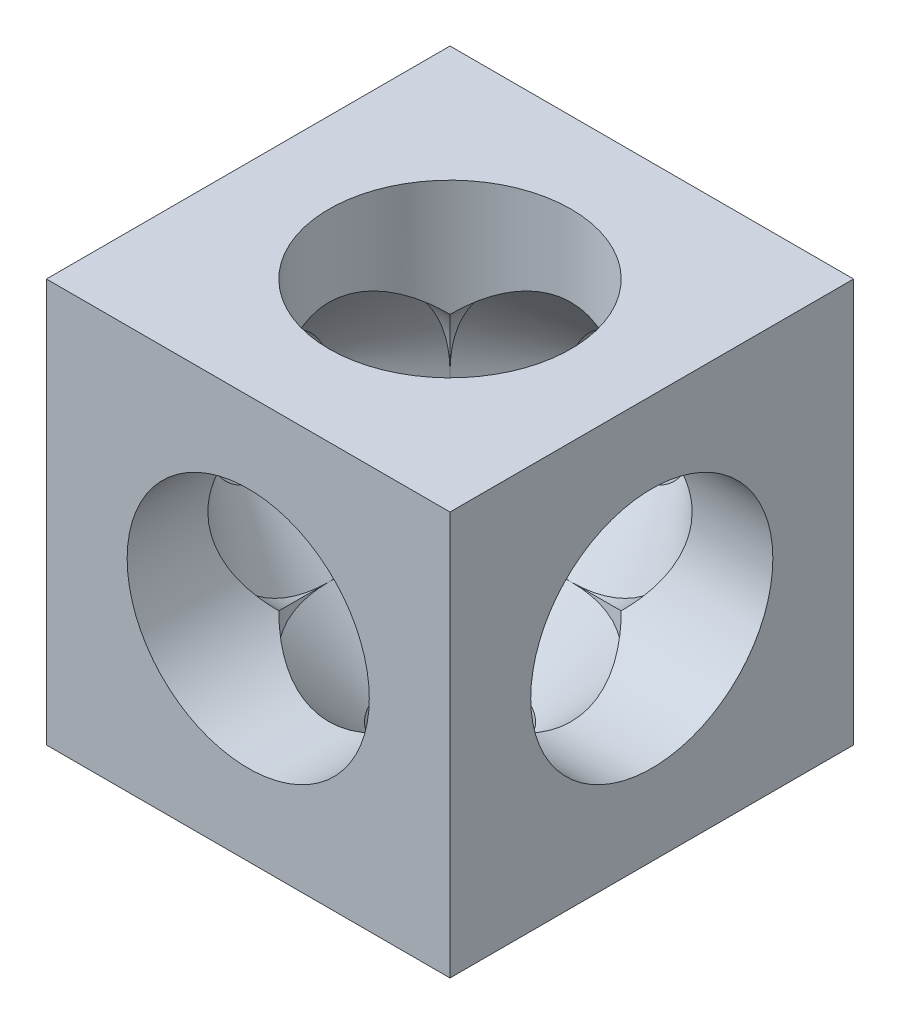
ISO-10303-21;
HEADER;
FILE_DESCRIPTION(('STEP AP214'),'2;1');
FILE_NAME('part.step','',(''),(''),'','','');
FILE_SCHEMA(('AUTOMOTIVE_DESIGN { 1 0 10303 214 1 1 1 1 }'));
ENDSEC;
DATA;
#1=APPLICATION_CONTEXT('core data for automotive mechanical design processes');
#2=APPLICATION_PROTOCOL_DEFINITION('international standard','automotive_design',2000,#1);
#3=PRODUCT_CONTEXT('',#1,'mechanical');
#4=PRODUCT('Part','Part','',(#3));
#5=PRODUCT_RELATED_PRODUCT_CATEGORY('part','',(#4));
#6=PRODUCT_DEFINITION_FORMATION('','',#4);
#7=PRODUCT_DEFINITION_CONTEXT('part definition',#1,'design');
#8=PRODUCT_DEFINITION('design','',#6,#7);
#9=PRODUCT_DEFINITION_SHAPE('','',#8);
#10=(LENGTH_UNIT() NAMED_UNIT(*) SI_UNIT(.MILLI.,.METRE.));
#11=(NAMED_UNIT(*) PLANE_ANGLE_UNIT() SI_UNIT($,.RADIAN.));
#12=(NAMED_UNIT(*) SI_UNIT($,.STERADIAN.) SOLID_ANGLE_UNIT());
#13=UNCERTAINTY_MEASURE_WITH_UNIT(LENGTH_MEASURE(1.E-05),#10,'distance_accuracy_value','');
#14=(GEOMETRIC_REPRESENTATION_CONTEXT(3) GLOBAL_UNCERTAINTY_ASSIGNED_CONTEXT((#13)) GLOBAL_UNIT_ASSIGNED_CONTEXT((#10,
#11,#12)) REPRESENTATION_CONTEXT('',''));
#15=CARTESIAN_POINT('',(0.,0.,0.));
#16=DIRECTION('',(0.,0.,1.));
#17=DIRECTION('',(1.,0.,0.));
#18=AXIS2_PLACEMENT_3D('',#15,#16,#17);
#19=CARTESIAN_POINT('',(0.,0.,5.));
#20=DIRECTION('',(0.,0.,1.));
#21=DIRECTION('',(1.,0.,0.));
#22=AXIS2_PLACEMENT_3D('',#19,#20,#21);
#23=PLANE('',#22);
#24=CARTESIAN_POINT('',(0.,0.,5.));
#25=DIRECTION('',(0.,0.,-1.));
#26=DIRECTION('',(-1.,0.,0.));
#27=AXIS2_PLACEMENT_3D('',#24,#25,#26);
#28=CIRCLE('',#27,3.);
#29=CARTESIAN_POINT('',(-3.,0.,5.));
#30=VERTEX_POINT('',#29);
#31=EDGE_CURVE('E234',#30,#30,#28,.T.);
#32=ORIENTED_EDGE('',*,*,#31,.T.);
#33=EDGE_LOOP('',(#32));
#34=FACE_BOUND('',#33,.T.);
#35=DIRECTION('',(0.,-1.,0.));
#36=VECTOR('',#35,1.);
#37=CARTESIAN_POINT('',(5.,5.,5.));
#38=LINE('',#37,#36);
#39=CARTESIAN_POINT('',(5.,5.,5.));
#40=VERTEX_POINT('',#39);
#41=CARTESIAN_POINT('',(5.,-5.,5.));
#42=VERTEX_POINT('',#41);
#43=EDGE_CURVE('E284',#40,#42,#38,.T.);
#44=ORIENTED_EDGE('',*,*,#43,.F.);
#45=DIRECTION('',(1.,0.,0.));
#46=VECTOR('',#45,1.);
#47=CARTESIAN_POINT('',(-5.,5.,5.));
#48=LINE('',#47,#46);
#49=CARTESIAN_POINT('',(-5.,5.,5.));
#50=VERTEX_POINT('',#49);
#51=EDGE_CURVE('E10',#50,#40,#48,.T.);
#52=ORIENTED_EDGE('',*,*,#51,.F.);
#53=DIRECTION('',(0.,1.,0.));
#54=VECTOR('',#53,1.);
#55=CARTESIAN_POINT('',(-5.,-5.,5.));
#56=LINE('',#55,#54);
#57=CARTESIAN_POINT('',(-5.,-5.,5.));
#58=VERTEX_POINT('',#57);
#59=EDGE_CURVE('E212',#58,#50,#56,.T.);
#60=ORIENTED_EDGE('',*,*,#59,.F.);
#61=DIRECTION('',(-1.,0.,0.));
#62=VECTOR('',#61,1.);
#63=CARTESIAN_POINT('',(5.,-5.,5.));
#64=LINE('',#63,#62);
#65=EDGE_CURVE('E254',#42,#58,#64,.T.);
#66=ORIENTED_EDGE('',*,*,#65,.F.);
#67=EDGE_LOOP('',(#44,#52,#60,#66));
#68=FACE_BOUND('',#67,.T.);
#69=ADVANCED_FACE('F16',(#34,#68),#23,.T.);
#70=CARTESIAN_POINT('',(-5.,5.,0.));
#71=DIRECTION('',(0.,1.,0.));
#72=DIRECTION('',(1.,0.,0.));
#73=AXIS2_PLACEMENT_3D('',#70,#71,#72);
#74=PLANE('',#73);
#75=CARTESIAN_POINT('',(0.,5.,0.));
#76=DIRECTION('',(0.,-1.,0.));
#77=DIRECTION('',(0.,0.,-1.));
#78=AXIS2_PLACEMENT_3D('',#75,#76,#77);
#79=CIRCLE('',#78,3.);
#80=CARTESIAN_POINT('',(0.,5.,-3.));
#81=VERTEX_POINT('',#80);
#82=EDGE_CURVE('E219',#81,#81,#79,.T.);
#83=ORIENTED_EDGE('',*,*,#82,.T.);
#84=EDGE_LOOP('',(#83));
#85=FACE_BOUND('',#84,.T.);
#86=ORIENTED_EDGE('',*,*,#51,.T.);
#87=DIRECTION('',(0.,0.,-1.));
#88=VECTOR('',#87,1.);
#89=CARTESIAN_POINT('',(5.,5.,5.));
#90=LINE('',#89,#88);
#91=CARTESIAN_POINT('',(5.,5.,-5.));
#92=VERTEX_POINT('',#91);
#93=EDGE_CURVE('E250',#40,#92,#90,.T.);
#94=ORIENTED_EDGE('',*,*,#93,.T.);
#95=DIRECTION('',(-1.,0.,0.));
#96=VECTOR('',#95,1.);
#97=CARTESIAN_POINT('',(5.,5.,-5.));
#98=LINE('',#97,#96);
#99=CARTESIAN_POINT('',(-5.,5.,-5.));
#100=VERTEX_POINT('',#99);
#101=EDGE_CURVE('E301',#92,#100,#98,.T.);
#102=ORIENTED_EDGE('',*,*,#101,.T.);
#103=DIRECTION('',(0.,0.,1.));
#104=VECTOR('',#103,1.);
#105=CARTESIAN_POINT('',(-5.,5.,-5.));
#106=LINE('',#105,#104);
#107=EDGE_CURVE('E27',#100,#50,#106,.T.);
#108=ORIENTED_EDGE('',*,*,#107,.T.);
#109=EDGE_LOOP('',(#86,#94,#102,#108));
#110=FACE_BOUND('',#109,.T.);
#111=ADVANCED_FACE('F603',(#85,#110),#74,.T.);
#112=CARTESIAN_POINT('',(-5.,-5.,0.));
#113=DIRECTION('',(-1.,0.,0.));
#114=DIRECTION('',(0.,0.,1.));
#115=AXIS2_PLACEMENT_3D('',#112,#113,#114);
#116=PLANE('',#115);
#117=CARTESIAN_POINT('',(-5.,0.,0.));
#118=DIRECTION('',(1.,0.,0.));
#119=DIRECTION('',(0.,0.,-1.));
#120=AXIS2_PLACEMENT_3D('',#117,#118,#119);
#121=CIRCLE('',#120,1.5);
#122=CARTESIAN_POINT('',(-5.,0.,-1.5));
#123=VERTEX_POINT('',#122);
#124=EDGE_CURVE('E214',#123,#123,#121,.T.);
#125=ORIENTED_EDGE('',*,*,#124,.T.);
#126=EDGE_LOOP('',(#125));
#127=FACE_BOUND('',#126,.T.);
#128=ORIENTED_EDGE('',*,*,#59,.T.);
#129=ORIENTED_EDGE('',*,*,#107,.F.);
#130=DIRECTION('',(0.,-1.,0.));
#131=VECTOR('',#130,1.);
#132=CARTESIAN_POINT('',(-5.,5.,-5.));
#133=LINE('',#132,#131);
#134=CARTESIAN_POINT('',(-5.,-5.,-5.));
#135=VERTEX_POINT('',#134);
#136=EDGE_CURVE('E297',#100,#135,#133,.T.);
#137=ORIENTED_EDGE('',*,*,#136,.T.);
#138=DIRECTION('',(0.,0.,-1.));
#139=VECTOR('',#138,1.);
#140=CARTESIAN_POINT('',(-5.,-5.,5.));
#141=LINE('',#140,#139);
#142=EDGE_CURVE('E348',#58,#135,#141,.T.);
#143=ORIENTED_EDGE('',*,*,#142,.F.);
#144=EDGE_LOOP('',(#128,#129,#137,#143));
#145=FACE_BOUND('',#144,.T.);
#146=ADVANCED_FACE('F366',(#127,#145),#116,.T.);
#147=CARTESIAN_POINT('',(5.,-5.,0.));
#148=DIRECTION('',(0.,-1.,0.));
#149=DIRECTION('',(0.,0.,-1.));
#150=AXIS2_PLACEMENT_3D('',#147,#148,#149);
#151=PLANE('',#150);
#152=CARTESIAN_POINT('',(0.,-5.,0.));
#153=DIRECTION('',(0.,1.,0.));
#154=DIRECTION('',(0.,0.,-1.));
#155=AXIS2_PLACEMENT_3D('',#152,#153,#154);
#156=CIRCLE('',#155,1.5);
#157=CARTESIAN_POINT('',(0.,-5.,-1.5));
#158=VERTEX_POINT('',#157);
#159=EDGE_CURVE('E109',#158,#158,#156,.T.);
#160=ORIENTED_EDGE('',*,*,#159,.T.);
#161=EDGE_LOOP('',(#160));
#162=FACE_BOUND('',#161,.T.);
#163=ORIENTED_EDGE('',*,*,#65,.T.);
#164=ORIENTED_EDGE('',*,*,#142,.T.);
#165=DIRECTION('',(1.,0.,0.));
#166=VECTOR('',#165,1.);
#167=CARTESIAN_POINT('',(-5.,-5.,-5.));
#168=LINE('',#167,#166);
#169=CARTESIAN_POINT('',(5.,-5.,-5.));
#170=VERTEX_POINT('',#169);
#171=EDGE_CURVE('E281',#135,#170,#168,.T.);
#172=ORIENTED_EDGE('',*,*,#171,.T.);
#173=DIRECTION('',(0.,0.,-1.));
#174=VECTOR('',#173,1.);
#175=CARTESIAN_POINT('',(5.,-5.,5.));
#176=LINE('',#175,#174);
#177=EDGE_CURVE('E255',#42,#170,#176,.T.);
#178=ORIENTED_EDGE('',*,*,#177,.F.);
#179=EDGE_LOOP('',(#163,#164,#172,#178));
#180=FACE_BOUND('',#179,.T.);
#181=ADVANCED_FACE('F372',(#162,#180),#151,.T.);
#182=CARTESIAN_POINT('',(5.,5.,0.));
#183=DIRECTION('',(1.,0.,0.));
#184=DIRECTION('',(0.,1.,0.));
#185=AXIS2_PLACEMENT_3D('',#182,#183,#184);
#186=PLANE('',#185);
#187=CARTESIAN_POINT('',(5.,0.,0.));
#188=DIRECTION('',(-1.,0.,0.));
#189=DIRECTION('',(0.,0.,-1.));
#190=AXIS2_PLACEMENT_3D('',#187,#188,#189);
#191=CIRCLE('',#190,3.);
#192=CARTESIAN_POINT('',(5.,0.,-3.));
#193=VERTEX_POINT('',#192);
#194=EDGE_CURVE('E310',#193,#193,#191,.T.);
#195=ORIENTED_EDGE('',*,*,#194,.T.);
#196=EDGE_LOOP('',(#195));
#197=FACE_BOUND('',#196,.T.);
#198=ORIENTED_EDGE('',*,*,#43,.T.);
#199=ORIENTED_EDGE('',*,*,#177,.T.);
#200=DIRECTION('',(0.,1.,0.));
#201=VECTOR('',#200,1.);
#202=CARTESIAN_POINT('',(5.,-5.,-5.));
#203=LINE('',#202,#201);
#204=EDGE_CURVE('E285',#170,#92,#203,.T.);
#205=ORIENTED_EDGE('',*,*,#204,.T.);
#206=ORIENTED_EDGE('',*,*,#93,.F.);
#207=EDGE_LOOP('',(#198,#199,#205,#206));
#208=FACE_BOUND('',#207,.T.);
#209=ADVANCED_FACE('F378',(#197,#208),#186,.T.);
#210=CARTESIAN_POINT('',(0.,0.,-5.));
#211=DIRECTION('',(0.,0.,1.));
#212=DIRECTION('',(1.,0.,0.));
#213=AXIS2_PLACEMENT_3D('',#210,#211,#212);
#214=PLANE('',#213);
#215=CARTESIAN_POINT('',(0.,0.,-5.));
#216=DIRECTION('',(0.,0.,1.));
#217=DIRECTION('',(-1.,0.,0.));
#218=AXIS2_PLACEMENT_3D('',#215,#216,#217);
#219=CIRCLE('',#218,1.5);
#220=CARTESIAN_POINT('',(-1.5,0.,-5.));
#221=VERTEX_POINT('',#220);
#222=EDGE_CURVE('E256',#221,#221,#219,.T.);
#223=ORIENTED_EDGE('',*,*,#222,.T.);
#224=EDGE_LOOP('',(#223));
#225=FACE_BOUND('',#224,.T.);
#226=ORIENTED_EDGE('',*,*,#136,.F.);
#227=ORIENTED_EDGE('',*,*,#101,.F.);
#228=ORIENTED_EDGE('',*,*,#204,.F.);
#229=ORIENTED_EDGE('',*,*,#171,.F.);
#230=EDGE_LOOP('',(#226,#227,#228,#229));
#231=FACE_BOUND('',#230,.T.);
#232=ADVANCED_FACE('F501',(#225,#231),#214,.F.);
#233=CARTESIAN_POINT('',(0.,-3.75,0.));
#234=DIRECTION('',(0.,1.,0.));
#235=DIRECTION('',(0.,0.,-1.));
#236=AXIS2_PLACEMENT_3D('',#233,#234,#235);
#237=CONICAL_SURFACE('',#236,2.25,0.7853981625);
#238=CARTESIAN_POINT('',(0.,-4.5,0.));
#239=DIRECTION('',(0.,1.,0.));
#240=DIRECTION('',(0.,0.,-1.));
#241=AXIS2_PLACEMENT_3D('',#238,#239,#240);
#242=CIRCLE('',#241,1.5);
#243=CARTESIAN_POINT('',(0.,-4.5,-1.5));
#244=VERTEX_POINT('',#243);
#245=EDGE_CURVE('E96',#244,#244,#242,.T.);
#246=ORIENTED_EDGE('',*,*,#245,.F.);
#247=EDGE_LOOP('',(#246));
#248=FACE_BOUND('',#247,.T.);
#249=CARTESIAN_POINT('',(0.,-3.,0.));
#250=DIRECTION('',(0.,1.,0.));
#251=DIRECTION('',(0.,0.,-1.));
#252=AXIS2_PLACEMENT_3D('',#249,#250,#251);
#253=CIRCLE('',#252,3.);
#254=CARTESIAN_POINT('',(3.,-3.,0.));
#255=VERTEX_POINT('',#254);
#256=CARTESIAN_POINT('',(0.,-3.,-3.));
#257=VERTEX_POINT('',#256);
#258=EDGE_CURVE('E161',#255,#257,#253,.T.);
#259=ORIENTED_EDGE('',*,*,#258,.T.);
#260=CARTESIAN_POINT('',(0.,-3.,0.));
#261=DIRECTION('',(0.,1.,0.));
#262=DIRECTION('',(0.,0.,-1.));
#263=AXIS2_PLACEMENT_3D('',#260,#261,#262);
#264=CIRCLE('',#263,3.);
#265=CARTESIAN_POINT('',(-3.,-3.,0.));
#266=VERTEX_POINT('',#265);
#267=EDGE_CURVE('E146',#257,#266,#264,.T.);
#268=ORIENTED_EDGE('',*,*,#267,.T.);
#269=CARTESIAN_POINT('',(0.,-3.,0.));
#270=DIRECTION('',(0.,1.,0.));
#271=DIRECTION('',(0.,0.,-1.));
#272=AXIS2_PLACEMENT_3D('',#269,#270,#271);
#273=CIRCLE('',#272,3.);
#274=CARTESIAN_POINT('',(0.,-3.,3.));
#275=VERTEX_POINT('',#274);
#276=EDGE_CURVE('E157',#266,#275,#273,.T.);
#277=ORIENTED_EDGE('',*,*,#276,.T.);
#278=CARTESIAN_POINT('',(0.,-3.,0.));
#279=DIRECTION('',(0.,1.,0.));
#280=DIRECTION('',(0.,0.,-1.));
#281=AXIS2_PLACEMENT_3D('',#278,#279,#280);
#282=CIRCLE('',#281,3.);
#283=EDGE_CURVE('E165',#275,#255,#282,.T.);
#284=ORIENTED_EDGE('',*,*,#283,.T.);
#285=EDGE_LOOP('',(#259,#268,#277,#284));
#286=FACE_BOUND('',#285,.T.);
#287=ADVANCED_FACE('F163',(#248,#286),#237,.F.);
#288=CARTESIAN_POINT('',(0.,-4.,0.));
#289=DIRECTION('',(0.,1.,0.));
#290=DIRECTION('',(0.,0.,-1.));
#291=AXIS2_PLACEMENT_3D('',#288,#289,#290);
#292=CYLINDRICAL_SURFACE('',#291,1.5);
#293=ORIENTED_EDGE('',*,*,#245,.T.);
#294=EDGE_LOOP('',(#293));
#295=FACE_BOUND('',#294,.T.);
#296=ORIENTED_EDGE('',*,*,#159,.F.);
#297=EDGE_LOOP('',(#296));
#298=FACE_BOUND('',#297,.T.);
#299=ADVANCED_FACE('F476',(#295,#298),#292,.F.);
#300=CARTESIAN_POINT('',(0.,1.,0.));
#301=DIRECTION('',(0.,1.,0.));
#302=DIRECTION('',(0.,0.,-1.));
#303=AXIS2_PLACEMENT_3D('',#300,#301,#302);
#304=CYLINDRICAL_SURFACE('',#303,3.);
#305=CARTESIAN_POINT('',(0.,0.,0.));
#306=DIRECTION('',(0.,0.707106781186547,0.707106781186548));
#307=DIRECTION('',(0.,-0.707106781186548,0.707106781186547));
#308=AXIS2_PLACEMENT_3D('',#305,#306,#307);
#309=ELLIPSE('',#308,4.24264068711929,3.);
#310=CARTESIAN_POINT('',(-2.12132034355964,-2.12132034355965,2.12132034355965));
#311=VERTEX_POINT('',#310);
#312=EDGE_CURVE('E235',#311,#275,#309,.T.);
#313=ORIENTED_EDGE('',*,*,#312,.T.);
#314=ORIENTED_EDGE('',*,*,#276,.F.);
#315=CARTESIAN_POINT('',(0.,0.,0.));
#316=DIRECTION('',(-0.707106781186548,0.707106781186548,0.));
#317=DIRECTION('',(-0.707106781186548,-0.707106781186548,0.));
#318=AXIS2_PLACEMENT_3D('',#315,#316,#317);
#319=ELLIPSE('',#318,4.24264068711928,3.);
#320=EDGE_CURVE('E227',#266,#311,#319,.T.);
#321=ORIENTED_EDGE('',*,*,#320,.T.);
#322=EDGE_LOOP('',(#313,#314,#321));
#323=FACE_BOUND('',#322,.T.);
#324=ADVANCED_FACE('F18',(#323),#304,.F.);
#325=CARTESIAN_POINT('',(0.,1.,0.));
#326=DIRECTION('',(0.,1.,0.));
#327=DIRECTION('',(0.,0.,-1.));
#328=AXIS2_PLACEMENT_3D('',#325,#326,#327);
#329=CYLINDRICAL_SURFACE('',#328,3.);
#330=CARTESIAN_POINT('',(0.,0.,0.));
#331=DIRECTION('',(0.,0.707106781186548,-0.707106781186548));
#332=DIRECTION('',(0.,-0.707106781186548,-0.707106781186548));
#333=AXIS2_PLACEMENT_3D('',#330,#331,#332);
#334=ELLIPSE('',#333,4.24264068711929,3.);
#335=CARTESIAN_POINT('',(-2.12132034355965,-2.12132034355965,-2.12132034355965));
#336=VERTEX_POINT('',#335);
#337=EDGE_CURVE('E150',#257,#336,#334,.T.);
#338=ORIENTED_EDGE('',*,*,#337,.T.);
#339=CARTESIAN_POINT('',(0.,0.,0.));
#340=DIRECTION('',(-0.707106781186548,0.707106781186548,0.));
#341=DIRECTION('',(-0.707106781186548,-0.707106781186548,0.));
#342=AXIS2_PLACEMENT_3D('',#339,#340,#341);
#343=ELLIPSE('',#342,4.24264068711928,3.);
#344=EDGE_CURVE('E152',#336,#266,#343,.T.);
#345=ORIENTED_EDGE('',*,*,#344,.T.);
#346=ORIENTED_EDGE('',*,*,#267,.F.);
#347=EDGE_LOOP('',(#338,#345,#346));
#348=FACE_BOUND('',#347,.T.);
#349=ADVANCED_FACE('F148',(#348),#329,.F.);
#350=CARTESIAN_POINT('',(-3.75,0.,0.));
#351=DIRECTION('',(1.,0.,0.));
#352=DIRECTION('',(0.,0.,-1.));
#353=AXIS2_PLACEMENT_3D('',#350,#351,#352);
#354=CONICAL_SURFACE('',#353,2.25,0.7853981625);
#355=CARTESIAN_POINT('',(-3.,0.,0.));
#356=DIRECTION('',(-1.,0.,0.));
#357=DIRECTION('',(0.,0.,-1.));
#358=AXIS2_PLACEMENT_3D('',#355,#356,#357);
#359=CIRCLE('',#358,3.);
#360=CARTESIAN_POINT('',(-3.,3.,0.));
#361=VERTEX_POINT('',#360);
#362=CARTESIAN_POINT('',(-3.,0.,-3.));
#363=VERTEX_POINT('',#362);
#364=EDGE_CURVE('E276',#361,#363,#359,.T.);
#365=ORIENTED_EDGE('',*,*,#364,.F.);
#366=CARTESIAN_POINT('',(-3.,0.,0.));
#367=DIRECTION('',(-1.,0.,0.));
#368=DIRECTION('',(0.,0.,-1.));
#369=AXIS2_PLACEMENT_3D('',#366,#367,#368);
#370=CIRCLE('',#369,3.);
#371=CARTESIAN_POINT('',(-3.,0.,3.));
#372=VERTEX_POINT('',#371);
#373=EDGE_CURVE('E313',#372,#361,#370,.T.);
#374=ORIENTED_EDGE('',*,*,#373,.F.);
#375=CARTESIAN_POINT('',(-3.,0.,0.));
#376=DIRECTION('',(-1.,0.,0.));
#377=DIRECTION('',(0.,0.,-1.));
#378=AXIS2_PLACEMENT_3D('',#375,#376,#377);
#379=CIRCLE('',#378,3.);
#380=EDGE_CURVE('E218',#266,#372,#379,.T.);
#381=ORIENTED_EDGE('',*,*,#380,.F.);
#382=CARTESIAN_POINT('',(-3.,0.,0.));
#383=DIRECTION('',(-1.,0.,0.));
#384=DIRECTION('',(0.,0.,-1.));
#385=AXIS2_PLACEMENT_3D('',#382,#383,#384);
#386=CIRCLE('',#385,3.);
#387=EDGE_CURVE('E293',#363,#266,#386,.T.);
#388=ORIENTED_EDGE('',*,*,#387,.F.);
#389=EDGE_LOOP('',(#365,#374,#381,#388));
#390=FACE_BOUND('',#389,.T.);
#391=CARTESIAN_POINT('',(-4.5,0.,0.));
#392=DIRECTION('',(-1.,0.,0.));
#393=DIRECTION('',(0.,0.,-1.));
#394=AXIS2_PLACEMENT_3D('',#391,#392,#393);
#395=CIRCLE('',#394,1.5);
#396=CARTESIAN_POINT('',(-4.5,0.,-1.5));
#397=VERTEX_POINT('',#396);
#398=EDGE_CURVE('E158',#397,#397,#395,.T.);
#399=ORIENTED_EDGE('',*,*,#398,.T.);
#400=EDGE_LOOP('',(#399));
#401=FACE_BOUND('',#400,.T.);
#402=ADVANCED_FACE('F575',(#390,#401),#354,.F.);
#403=CARTESIAN_POINT('',(-4.,0.,0.));
#404=DIRECTION('',(-1.,0.,0.));
#405=DIRECTION('',(0.,0.,-1.));
#406=AXIS2_PLACEMENT_3D('',#403,#404,#405);
#407=CYLINDRICAL_SURFACE('',#406,1.5);
#408=ORIENTED_EDGE('',*,*,#398,.F.);
#409=EDGE_LOOP('',(#408));
#410=FACE_BOUND('',#409,.T.);
#411=ORIENTED_EDGE('',*,*,#124,.F.);
#412=EDGE_LOOP('',(#411));
#413=FACE_BOUND('',#412,.T.);
#414=ADVANCED_FACE('F615',(#410,#413),#407,.F.);
#415=CARTESIAN_POINT('',(1.,0.,0.));
#416=DIRECTION('',(-1.,0.,0.));
#417=DIRECTION('',(0.,0.,-1.));
#418=AXIS2_PLACEMENT_3D('',#415,#416,#417);
#419=CYLINDRICAL_SURFACE('',#418,3.);
#420=CARTESIAN_POINT('',(0.,0.,0.));
#421=DIRECTION('',(0.707106781186548,0.,0.707106781186548));
#422=DIRECTION('',(-0.707106781186548,0.,0.707106781186548));
#423=AXIS2_PLACEMENT_3D('',#420,#421,#422);
#424=ELLIPSE('',#423,4.24264068711928,3.);
#425=EDGE_CURVE('E230',#372,#311,#424,.T.);
#426=ORIENTED_EDGE('',*,*,#425,.T.);
#427=ORIENTED_EDGE('',*,*,#320,.F.);
#428=ORIENTED_EDGE('',*,*,#380,.T.);
#429=EDGE_LOOP('',(#426,#427,#428));
#430=FACE_BOUND('',#429,.T.);
#431=ADVANCED_FACE('F537',(#430),#419,.F.);
#432=CARTESIAN_POINT('',(1.,0.,0.));
#433=DIRECTION('',(-1.,0.,0.));
#434=DIRECTION('',(0.,0.,-1.));
#435=AXIS2_PLACEMENT_3D('',#432,#433,#434);
#436=CYLINDRICAL_SURFACE('',#435,3.);
#437=ORIENTED_EDGE('',*,*,#194,.F.);
#438=EDGE_LOOP('',(#437));
#439=FACE_BOUND('',#438,.T.);
#440=CARTESIAN_POINT('',(0.,0.,0.));
#441=DIRECTION('',(-0.707106781186548,0.,-0.707106781186548));
#442=DIRECTION('',(-0.707106781186548,0.,0.707106781186548));
#443=AXIS2_PLACEMENT_3D('',#440,#441,#442);
#444=ELLIPSE('',#443,4.24264068711928,3.);
#445=CARTESIAN_POINT('',(3.,0.,-3.));
#446=VERTEX_POINT('',#445);
#447=CARTESIAN_POINT('',(2.12132034355965,-2.12132034355965,-2.12132034355965));
#448=VERTEX_POINT('',#447);
#449=EDGE_CURVE('E198',#446,#448,#444,.T.);
#450=ORIENTED_EDGE('',*,*,#449,.T.);
#451=CARTESIAN_POINT('',(0.,0.,0.));
#452=DIRECTION('',(0.707106781186548,0.707106781186548,0.));
#453=DIRECTION('',(0.707106781186548,-0.707106781186548,0.));
#454=AXIS2_PLACEMENT_3D('',#451,#452,#453);
#455=ELLIPSE('',#454,4.24264068711928,3.);
#456=EDGE_CURVE('E170',#255,#448,#455,.T.);
#457=ORIENTED_EDGE('',*,*,#456,.F.);
#458=CARTESIAN_POINT('',(0.,0.,0.));
#459=DIRECTION('',(0.707106781186548,0.707106781186548,0.));
#460=DIRECTION('',(0.707106781186548,-0.707106781186548,0.));
#461=AXIS2_PLACEMENT_3D('',#458,#459,#460);
#462=ELLIPSE('',#461,4.24264068711928,3.);
#463=CARTESIAN_POINT('',(2.12132034355965,-2.12132034355965,2.12132034355964));
#464=VERTEX_POINT('',#463);
#465=EDGE_CURVE('E238',#464,#255,#462,.T.);
#466=ORIENTED_EDGE('',*,*,#465,.F.);
#467=CARTESIAN_POINT('',(0.,0.,0.));
#468=DIRECTION('',(-0.707106781186547,0.,0.707106781186548));
#469=DIRECTION('',(-0.707106781186548,0.,-0.707106781186547));
#470=AXIS2_PLACEMENT_3D('',#467,#468,#469);
#471=ELLIPSE('',#470,4.24264068711929,3.);
#472=CARTESIAN_POINT('',(2.12132034355965,2.12132034355965,2.12132034355964));
#473=VERTEX_POINT('',#472);
#474=EDGE_CURVE('E272',#464,#473,#471,.T.);
#475=ORIENTED_EDGE('',*,*,#474,.T.);
#476=CARTESIAN_POINT('',(0.,0.,0.));
#477=DIRECTION('',(0.707106781186548,-0.707106781186548,0.));
#478=DIRECTION('',(-0.707106781186548,-0.707106781186548,0.));
#479=AXIS2_PLACEMENT_3D('',#476,#477,#478);
#480=ELLIPSE('',#479,4.24264068711928,3.);
#481=CARTESIAN_POINT('',(2.12132034355965,2.12132034355965,-2.12132034355965));
#482=VERTEX_POINT('',#481);
#483=EDGE_CURVE('E223',#482,#473,#480,.T.);
#484=ORIENTED_EDGE('',*,*,#483,.F.);
#485=CARTESIAN_POINT('',(0.,0.,0.));
#486=DIRECTION('',(-0.707106781186548,0.,-0.707106781186548));
#487=DIRECTION('',(-0.707106781186548,0.,0.707106781186548));
#488=AXIS2_PLACEMENT_3D('',#485,#486,#487);
#489=ELLIPSE('',#488,4.24264068711928,3.);
#490=EDGE_CURVE('E260',#482,#446,#489,.T.);
#491=ORIENTED_EDGE('',*,*,#490,.T.);
#492=EDGE_LOOP('',(#450,#457,#466,#475,#484,#491));
#493=FACE_BOUND('',#492,.T.);
#494=ADVANCED_FACE('F391',(#439,#493),#436,.F.);
#495=CARTESIAN_POINT('',(1.,0.,0.));
#496=DIRECTION('',(-1.,0.,0.));
#497=DIRECTION('',(0.,0.,-1.));
#498=AXIS2_PLACEMENT_3D('',#495,#496,#497);
#499=CYLINDRICAL_SURFACE('',#498,3.);
#500=CARTESIAN_POINT('',(0.,0.,0.));
#501=DIRECTION('',(0.707106781186548,0.,0.707106781186548));
#502=DIRECTION('',(-0.707106781186548,0.,0.707106781186548));
#503=AXIS2_PLACEMENT_3D('',#500,#501,#502);
#504=ELLIPSE('',#503,4.24264068711928,3.);
#505=CARTESIAN_POINT('',(-2.12132034355965,2.12132034355964,2.12132034355965));
#506=VERTEX_POINT('',#505);
#507=EDGE_CURVE('E20',#506,#372,#504,.T.);
#508=ORIENTED_EDGE('',*,*,#507,.T.);
#509=ORIENTED_EDGE('',*,*,#373,.T.);
#510=CARTESIAN_POINT('',(0.,0.,0.));
#511=DIRECTION('',(-0.707106781186548,-0.707106781186548,0.));
#512=DIRECTION('',(0.707106781186548,-0.707106781186548,0.));
#513=AXIS2_PLACEMENT_3D('',#510,#511,#512);
#514=ELLIPSE('',#513,4.24264068711928,3.);
#515=EDGE_CURVE('E321',#506,#361,#514,.T.);
#516=ORIENTED_EDGE('',*,*,#515,.F.);
#517=EDGE_LOOP('',(#508,#509,#516));
#518=FACE_BOUND('',#517,.T.);
#519=ADVANCED_FACE('F536',(#518),#499,.F.);
#520=CARTESIAN_POINT('',(0.,1.,0.));
#521=DIRECTION('',(0.,1.,0.));
#522=DIRECTION('',(0.,0.,-1.));
#523=AXIS2_PLACEMENT_3D('',#520,#521,#522);
#524=CYLINDRICAL_SURFACE('',#523,3.);
#525=CARTESIAN_POINT('',(0.,0.,0.));
#526=DIRECTION('',(0.,-0.707106781186547,-0.707106781186548));
#527=DIRECTION('',(0.,-0.707106781186548,0.707106781186547));
#528=AXIS2_PLACEMENT_3D('',#525,#526,#527);
#529=ELLIPSE('',#528,4.24264068711929,3.);
#530=CARTESIAN_POINT('',(-2.12132034355965,2.12132034355965,-2.12132034355965));
#531=VERTEX_POINT('',#530);
#532=CARTESIAN_POINT('',(0.,3.,-3.));
#533=VERTEX_POINT('',#532);
#534=EDGE_CURVE('E241',#531,#533,#529,.T.);
#535=ORIENTED_EDGE('',*,*,#534,.T.);
#536=CARTESIAN_POINT('',(0.,0.,0.));
#537=DIRECTION('',(0.,-0.707106781186547,-0.707106781186548));
#538=DIRECTION('',(0.,-0.707106781186548,0.707106781186547));
#539=AXIS2_PLACEMENT_3D('',#536,#537,#538);
#540=ELLIPSE('',#539,4.24264068711929,3.);
#541=EDGE_CURVE('E245',#533,#482,#540,.T.);
#542=ORIENTED_EDGE('',*,*,#541,.T.);
#543=ORIENTED_EDGE('',*,*,#483,.T.);
#544=CARTESIAN_POINT('',(0.,0.,0.));
#545=DIRECTION('',(0.,-0.707106781186548,0.707106781186548));
#546=DIRECTION('',(0.,-0.707106781186548,-0.707106781186548));
#547=AXIS2_PLACEMENT_3D('',#544,#545,#546);
#548=ELLIPSE('',#547,4.24264068711929,3.);
#549=EDGE_CURVE('E277',#473,#506,#548,.T.);
#550=ORIENTED_EDGE('',*,*,#549,.T.);
#551=ORIENTED_EDGE('',*,*,#515,.T.);
#552=CARTESIAN_POINT('',(0.,0.,0.));
#553=DIRECTION('',(-0.707106781186548,-0.707106781186548,0.));
#554=DIRECTION('',(0.707106781186548,-0.707106781186548,0.));
#555=AXIS2_PLACEMENT_3D('',#552,#553,#554);
#556=ELLIPSE('',#555,4.24264068711928,3.);
#557=EDGE_CURVE('E273',#361,#531,#556,.T.);
#558=ORIENTED_EDGE('',*,*,#557,.T.);
#559=EDGE_LOOP('',(#535,#542,#543,#550,#551,#558));
#560=FACE_BOUND('',#559,.T.);
#561=ORIENTED_EDGE('',*,*,#82,.F.);
#562=EDGE_LOOP('',(#561));
#563=FACE_BOUND('',#562,.T.);
#564=ADVANCED_FACE('F397',(#560,#563),#524,.F.);
#565=CARTESIAN_POINT('',(0.,1.,0.));
#566=DIRECTION('',(0.,1.,0.));
#567=DIRECTION('',(0.,0.,-1.));
#568=AXIS2_PLACEMENT_3D('',#565,#566,#567);
#569=CYLINDRICAL_SURFACE('',#568,3.);
#570=CARTESIAN_POINT('',(0.,0.,0.));
#571=DIRECTION('',(0.,0.707106781186547,0.707106781186548));
#572=DIRECTION('',(0.,-0.707106781186548,0.707106781186547));
#573=AXIS2_PLACEMENT_3D('',#570,#571,#572);
#574=ELLIPSE('',#573,4.24264068711929,3.);
#575=EDGE_CURVE('E249',#275,#464,#574,.T.);
#576=ORIENTED_EDGE('',*,*,#575,.T.);
#577=ORIENTED_EDGE('',*,*,#465,.T.);
#578=ORIENTED_EDGE('',*,*,#283,.F.);
#579=EDGE_LOOP('',(#576,#577,#578));
#580=FACE_BOUND('',#579,.T.);
#581=ADVANCED_FACE('F583',(#580),#569,.F.);
#582=CARTESIAN_POINT('',(0.,1.,0.));
#583=DIRECTION('',(0.,1.,0.));
#584=DIRECTION('',(0.,0.,-1.));
#585=AXIS2_PLACEMENT_3D('',#582,#583,#584);
#586=CYLINDRICAL_SURFACE('',#585,3.);
#587=CARTESIAN_POINT('',(0.,0.,0.));
#588=DIRECTION('',(0.,0.707106781186548,-0.707106781186548));
#589=DIRECTION('',(0.,-0.707106781186548,-0.707106781186548));
#590=AXIS2_PLACEMENT_3D('',#587,#588,#589);
#591=ELLIPSE('',#590,4.24264068711929,3.);
#592=EDGE_CURVE('E196',#448,#257,#591,.T.);
#593=ORIENTED_EDGE('',*,*,#592,.T.);
#594=ORIENTED_EDGE('',*,*,#258,.F.);
#595=ORIENTED_EDGE('',*,*,#456,.T.);
#596=EDGE_LOOP('',(#593,#594,#595));
#597=FACE_BOUND('',#596,.T.);
#598=ADVANCED_FACE('F201',(#597),#586,.F.);
#599=CARTESIAN_POINT('',(1.,0.,0.));
#600=DIRECTION('',(-1.,0.,0.));
#601=DIRECTION('',(0.,0.,-1.));
#602=AXIS2_PLACEMENT_3D('',#599,#600,#601);
#603=CYLINDRICAL_SURFACE('',#602,3.);
#604=CARTESIAN_POINT('',(0.,0.,0.));
#605=DIRECTION('',(0.707106781186547,0.,-0.707106781186548));
#606=DIRECTION('',(-0.707106781186548,0.,-0.707106781186547));
#607=AXIS2_PLACEMENT_3D('',#604,#605,#606);
#608=ELLIPSE('',#607,4.24264068711929,3.);
#609=EDGE_CURVE('E190',#336,#363,#608,.T.);
#610=ORIENTED_EDGE('',*,*,#609,.T.);
#611=ORIENTED_EDGE('',*,*,#387,.T.);
#612=ORIENTED_EDGE('',*,*,#344,.F.);
#613=EDGE_LOOP('',(#610,#611,#612));
#614=FACE_BOUND('',#613,.T.);
#615=ADVANCED_FACE('F527',(#614),#603,.F.);
#616=CARTESIAN_POINT('',(1.,0.,0.));
#617=DIRECTION('',(-1.,0.,0.));
#618=DIRECTION('',(0.,0.,-1.));
#619=AXIS2_PLACEMENT_3D('',#616,#617,#618);
#620=CYLINDRICAL_SURFACE('',#619,3.);
#621=CARTESIAN_POINT('',(0.,0.,0.));
#622=DIRECTION('',(0.707106781186547,0.,-0.707106781186548));
#623=DIRECTION('',(-0.707106781186548,0.,-0.707106781186547));
#624=AXIS2_PLACEMENT_3D('',#621,#622,#623);
#625=ELLIPSE('',#624,4.24264068711929,3.);
#626=EDGE_CURVE('E187',#363,#531,#625,.T.);
#627=ORIENTED_EDGE('',*,*,#626,.T.);
#628=ORIENTED_EDGE('',*,*,#557,.F.);
#629=ORIENTED_EDGE('',*,*,#364,.T.);
#630=EDGE_LOOP('',(#627,#628,#629));
#631=FACE_BOUND('',#630,.T.);
#632=ADVANCED_FACE('F486',(#631),#620,.F.);
#633=CARTESIAN_POINT('',(0.,0.,-3.75));
#634=DIRECTION('',(0.,0.,1.));
#635=DIRECTION('',(-1.,0.,0.));
#636=AXIS2_PLACEMENT_3D('',#633,#634,#635);
#637=CONICAL_SURFACE('',#636,2.25,0.785398162499999);
#638=CARTESIAN_POINT('',(0.,0.,-4.5));
#639=DIRECTION('',(0.,0.,1.));
#640=DIRECTION('',(-1.,0.,0.));
#641=AXIS2_PLACEMENT_3D('',#638,#639,#640);
#642=CIRCLE('',#641,1.5);
#643=CARTESIAN_POINT('',(-1.5,0.,-4.5));
#644=VERTEX_POINT('',#643);
#645=EDGE_CURVE('E259',#644,#644,#642,.T.);
#646=ORIENTED_EDGE('',*,*,#645,.F.);
#647=EDGE_LOOP('',(#646));
#648=FACE_BOUND('',#647,.T.);
#649=CARTESIAN_POINT('',(0.,0.,-3.));
#650=DIRECTION('',(0.,0.,1.));
#651=DIRECTION('',(-1.,0.,0.));
#652=AXIS2_PLACEMENT_3D('',#649,#650,#651);
#653=CIRCLE('',#652,3.);
#654=EDGE_CURVE('E176',#363,#257,#653,.T.);
#655=ORIENTED_EDGE('',*,*,#654,.T.);
#656=CARTESIAN_POINT('',(0.,0.,-3.));
#657=DIRECTION('',(0.,0.,1.));
#658=DIRECTION('',(-1.,0.,0.));
#659=AXIS2_PLACEMENT_3D('',#656,#657,#658);
#660=CIRCLE('',#659,3.);
#661=EDGE_CURVE('E179',#257,#446,#660,.T.);
#662=ORIENTED_EDGE('',*,*,#661,.T.);
#663=CARTESIAN_POINT('',(0.,0.,-3.));
#664=DIRECTION('',(0.,0.,1.));
#665=DIRECTION('',(-1.,0.,0.));
#666=AXIS2_PLACEMENT_3D('',#663,#664,#665);
#667=CIRCLE('',#666,3.);
#668=EDGE_CURVE('E265',#446,#533,#667,.T.);
#669=ORIENTED_EDGE('',*,*,#668,.T.);
#670=CARTESIAN_POINT('',(0.,0.,-3.));
#671=DIRECTION('',(0.,0.,1.));
#672=DIRECTION('',(-1.,0.,0.));
#673=AXIS2_PLACEMENT_3D('',#670,#671,#672);
#674=CIRCLE('',#673,3.);
#675=EDGE_CURVE('E182',#533,#363,#674,.T.);
#676=ORIENTED_EDGE('',*,*,#675,.T.);
#677=EDGE_LOOP('',(#655,#662,#669,#676));
#678=FACE_BOUND('',#677,.T.);
#679=ADVANCED_FACE('F177',(#648,#678),#637,.F.);
#680=CARTESIAN_POINT('',(0.,0.,1.));
#681=DIRECTION('',(0.,0.,1.));
#682=DIRECTION('',(-1.,0.,0.));
#683=AXIS2_PLACEMENT_3D('',#680,#681,#682);
#684=CYLINDRICAL_SURFACE('',#683,3.);
#685=ORIENTED_EDGE('',*,*,#31,.F.);
#686=EDGE_LOOP('',(#685));
#687=FACE_BOUND('',#686,.T.);
#688=ORIENTED_EDGE('',*,*,#507,.F.);
#689=ORIENTED_EDGE('',*,*,#549,.F.);
#690=ORIENTED_EDGE('',*,*,#474,.F.);
#691=ORIENTED_EDGE('',*,*,#575,.F.);
#692=ORIENTED_EDGE('',*,*,#312,.F.);
#693=ORIENTED_EDGE('',*,*,#425,.F.);
#694=EDGE_LOOP('',(#688,#689,#690,#691,#692,#693));
#695=FACE_BOUND('',#694,.T.);
#696=ADVANCED_FACE('F485',(#687,#695),#684,.F.);
#697=CARTESIAN_POINT('',(0.,0.,-4.));
#698=DIRECTION('',(0.,0.,1.));
#699=DIRECTION('',(-1.,0.,0.));
#700=AXIS2_PLACEMENT_3D('',#697,#698,#699);
#701=CYLINDRICAL_SURFACE('',#700,1.5);
#702=ORIENTED_EDGE('',*,*,#645,.T.);
#703=EDGE_LOOP('',(#702));
#704=FACE_BOUND('',#703,.T.);
#705=ORIENTED_EDGE('',*,*,#222,.F.);
#706=EDGE_LOOP('',(#705));
#707=FACE_BOUND('',#706,.T.);
#708=ADVANCED_FACE('F518',(#704,#707),#701,.F.);
#709=CARTESIAN_POINT('',(0.,0.,1.));
#710=DIRECTION('',(0.,0.,1.));
#711=DIRECTION('',(-1.,0.,0.));
#712=AXIS2_PLACEMENT_3D('',#709,#710,#711);
#713=CYLINDRICAL_SURFACE('',#712,3.);
#714=ORIENTED_EDGE('',*,*,#541,.F.);
#715=ORIENTED_EDGE('',*,*,#668,.F.);
#716=ORIENTED_EDGE('',*,*,#490,.F.);
#717=EDGE_LOOP('',(#714,#715,#716));
#718=FACE_BOUND('',#717,.T.);
#719=ADVANCED_FACE('F394',(#718),#713,.F.);
#720=CARTESIAN_POINT('',(0.,0.,1.));
#721=DIRECTION('',(0.,0.,1.));
#722=DIRECTION('',(-1.,0.,0.));
#723=AXIS2_PLACEMENT_3D('',#720,#721,#722);
#724=CYLINDRICAL_SURFACE('',#723,3.);
#725=ORIENTED_EDGE('',*,*,#626,.F.);
#726=ORIENTED_EDGE('',*,*,#675,.F.);
#727=ORIENTED_EDGE('',*,*,#534,.F.);
#728=EDGE_LOOP('',(#725,#726,#727));
#729=FACE_BOUND('',#728,.T.);
#730=ADVANCED_FACE('F401',(#729),#724,.F.);
#731=CARTESIAN_POINT('',(0.,0.,1.));
#732=DIRECTION('',(0.,0.,1.));
#733=DIRECTION('',(-1.,0.,0.));
#734=AXIS2_PLACEMENT_3D('',#731,#732,#733);
#735=CYLINDRICAL_SURFACE('',#734,3.);
#736=ORIENTED_EDGE('',*,*,#609,.F.);
#737=ORIENTED_EDGE('',*,*,#337,.F.);
#738=ORIENTED_EDGE('',*,*,#654,.F.);
#739=EDGE_LOOP('',(#736,#737,#738));
#740=FACE_BOUND('',#739,.T.);
#741=ADVANCED_FACE('F189',(#740),#735,.F.);
#742=CARTESIAN_POINT('',(0.,0.,1.));
#743=DIRECTION('',(0.,0.,1.));
#744=DIRECTION('',(-1.,0.,0.));
#745=AXIS2_PLACEMENT_3D('',#742,#743,#744);
#746=CYLINDRICAL_SURFACE('',#745,3.);
#747=ORIENTED_EDGE('',*,*,#592,.F.);
#748=ORIENTED_EDGE('',*,*,#449,.F.);
#749=ORIENTED_EDGE('',*,*,#661,.F.);
#750=EDGE_LOOP('',(#747,#748,#749));
#751=FACE_BOUND('',#750,.T.);
#752=ADVANCED_FACE('F195',(#751),#746,.F.);
#753=CLOSED_SHELL('',(#69,#111,#146,#181,#209,#232,#287,#299,#324,#349,#402,#414,#431,#494,#519,
#564,#581,#598,#615,#632,#679,#696,#708,#719,#730,#741,#752));
#754=MANIFOLD_SOLID_BREP('B1',#753);
#755=ADVANCED_BREP_SHAPE_REPRESENTATION('',(#18,#754),#14);
#756=SHAPE_DEFINITION_REPRESENTATION(#9,#755);
ENDSEC;
END-ISO-10303-21;
